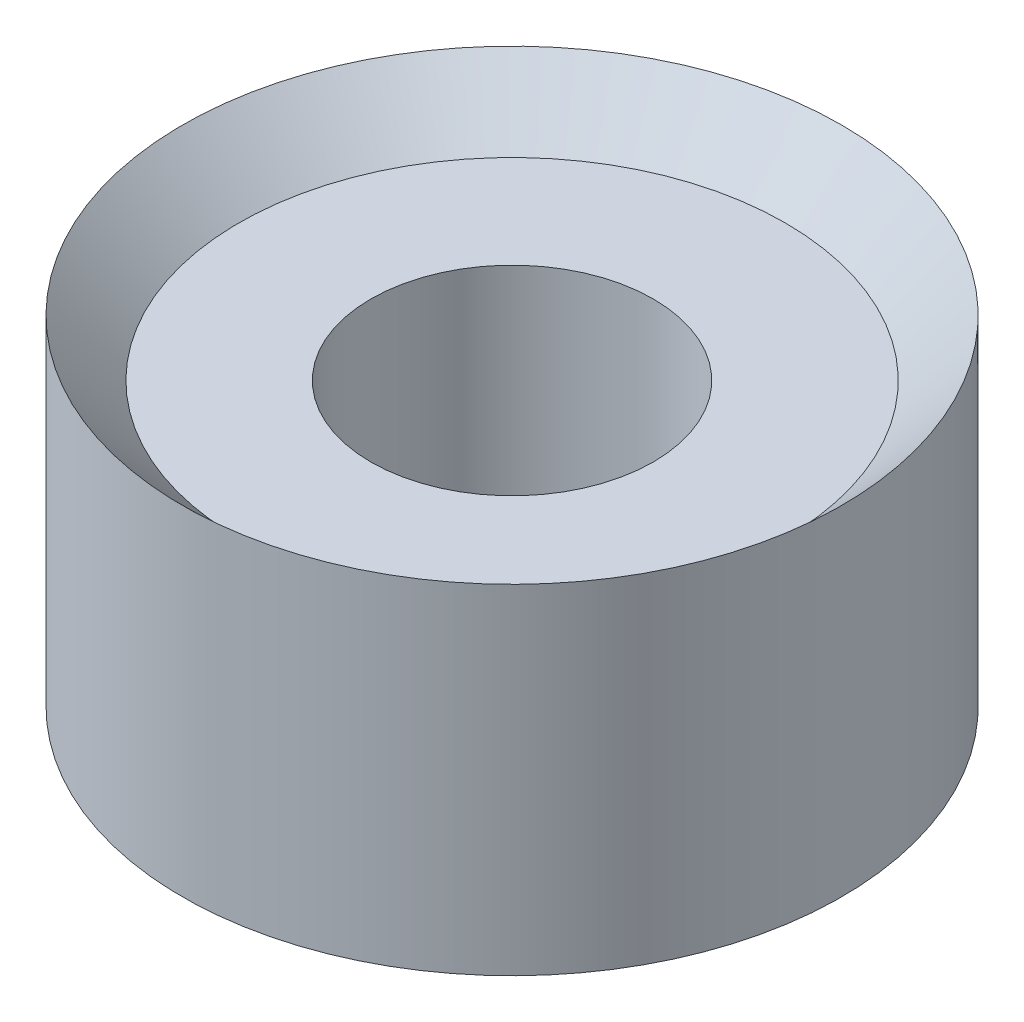
ISO-10303-21;
HEADER;
FILE_DESCRIPTION(('STEP AP214'),'2;1');
FILE_NAME('part.step','',(''),(''),'','','');
FILE_SCHEMA(('AUTOMOTIVE_DESIGN { 1 0 10303 214 1 1 1 1 }'));
ENDSEC;
DATA;
#1=APPLICATION_CONTEXT('core data for automotive mechanical design processes');
#2=APPLICATION_PROTOCOL_DEFINITION('international standard','automotive_design',2000,#1);
#3=PRODUCT_CONTEXT('',#1,'mechanical');
#4=PRODUCT('Part','Part','',(#3));
#5=PRODUCT_RELATED_PRODUCT_CATEGORY('part','',(#4));
#6=PRODUCT_DEFINITION_FORMATION('','',#4);
#7=PRODUCT_DEFINITION_CONTEXT('part definition',#1,'design');
#8=PRODUCT_DEFINITION('design','',#6,#7);
#9=PRODUCT_DEFINITION_SHAPE('','',#8);
#10=(LENGTH_UNIT() NAMED_UNIT(*) SI_UNIT(.MILLI.,.METRE.));
#11=(NAMED_UNIT(*) PLANE_ANGLE_UNIT() SI_UNIT($,.RADIAN.));
#12=(NAMED_UNIT(*) SI_UNIT($,.STERADIAN.) SOLID_ANGLE_UNIT());
#13=UNCERTAINTY_MEASURE_WITH_UNIT(LENGTH_MEASURE(1.E-05),#10,'distance_accuracy_value','');
#14=(GEOMETRIC_REPRESENTATION_CONTEXT(3) GLOBAL_UNCERTAINTY_ASSIGNED_CONTEXT((#13)) GLOBAL_UNIT_ASSIGNED_CONTEXT((#10,
#11,#12)) REPRESENTATION_CONTEXT('',''));
#15=CARTESIAN_POINT('',(0.,0.,0.));
#16=DIRECTION('',(0.,0.,1.));
#17=DIRECTION('',(1.,0.,0.));
#18=AXIS2_PLACEMENT_3D('',#15,#16,#17);
#19=CARTESIAN_POINT('',(0.,-0.9,0.));
#20=DIRECTION('',(0.,-1.,0.));
#21=DIRECTION('',(0.,0.,-1.));
#22=AXIS2_PLACEMENT_3D('',#19,#20,#21);
#23=CYLINDRICAL_SURFACE('',#22,7.5);
#24=CARTESIAN_POINT('',(0.,15.,0.));
#25=DIRECTION('',(0.,-1.,0.));
#26=DIRECTION('',(0.,0.,-1.));
#27=AXIS2_PLACEMENT_3D('',#24,#25,#26);
#28=CIRCLE('',#27,7.5);
#29=CARTESIAN_POINT('',(0.,15.,-7.5));
#30=VERTEX_POINT('',#29);
#31=EDGE_CURVE('E50',#30,#30,#28,.T.);
#32=ORIENTED_EDGE('',*,*,#31,.F.);
#33=EDGE_LOOP('',(#32));
#34=FACE_BOUND('',#33,.T.);
#35=CARTESIAN_POINT('',(0.,0.,0.));
#36=DIRECTION('',(0.,-1.,0.));
#37=DIRECTION('',(0.,0.,-1.));
#38=AXIS2_PLACEMENT_3D('',#35,#36,#37);
#39=CIRCLE('',#38,7.5);
#40=CARTESIAN_POINT('',(0.,0.,-7.5));
#41=VERTEX_POINT('',#40);
#42=EDGE_CURVE('E10',#41,#41,#39,.T.);
#43=ORIENTED_EDGE('',*,*,#42,.T.);
#44=EDGE_LOOP('',(#43));
#45=FACE_BOUND('',#44,.T.);
#46=ADVANCED_FACE('F31',(#34,#45),#23,.F.);
#47=CARTESIAN_POINT('',(-7.5,0.,0.));
#48=DIRECTION('',(0.,1.,0.));
#49=DIRECTION('',(0.,0.,1.));
#50=AXIS2_PLACEMENT_3D('',#47,#48,#49);
#51=PLANE('',#50);
#52=ORIENTED_EDGE('',*,*,#42,.F.);
#53=EDGE_LOOP('',(#52));
#54=FACE_BOUND('',#53,.T.);
#55=CARTESIAN_POINT('',(0.,0.,0.));
#56=DIRECTION('',(0.,-1.,0.));
#57=DIRECTION('',(0.,0.,-1.));
#58=AXIS2_PLACEMENT_3D('',#55,#56,#57);
#59=CIRCLE('',#58,17.5);
#60=CARTESIAN_POINT('',(0.,0.,-17.5));
#61=VERTEX_POINT('',#60);
#62=EDGE_CURVE('E37',#61,#61,#59,.T.);
#63=ORIENTED_EDGE('',*,*,#62,.T.);
#64=EDGE_LOOP('',(#63));
#65=FACE_BOUND('',#64,.T.);
#66=ADVANCED_FACE('F57',(#54,#65),#51,.F.);
#67=CARTESIAN_POINT('',(0.,-0.9,0.));
#68=DIRECTION('',(0.,-1.,0.));
#69=DIRECTION('',(0.,0.,-1.));
#70=AXIS2_PLACEMENT_3D('',#67,#68,#69);
#71=CYLINDRICAL_SURFACE('',#70,17.5);
#72=ORIENTED_EDGE('',*,*,#62,.F.);
#73=EDGE_LOOP('',(#72));
#74=FACE_BOUND('',#73,.T.);
#75=CARTESIAN_POINT('',(0.,18.,0.));
#76=DIRECTION('',(0.,-1.,0.));
#77=DIRECTION('',(0.,0.,-1.));
#78=AXIS2_PLACEMENT_3D('',#75,#76,#77);
#79=CIRCLE('',#78,17.5);
#80=CARTESIAN_POINT('',(0.,18.,-17.5));
#81=VERTEX_POINT('',#80);
#82=EDGE_CURVE('E41',#81,#81,#79,.T.);
#83=ORIENTED_EDGE('',*,*,#82,.T.);
#84=EDGE_LOOP('',(#83));
#85=FACE_BOUND('',#84,.T.);
#86=ADVANCED_FACE('F61',(#74,#85),#71,.T.);
#87=CARTESIAN_POINT('',(0.,15.,0.));
#88=DIRECTION('',(0.,1.,0.));
#89=DIRECTION('',(0.,0.,1.));
#90=AXIS2_PLACEMENT_3D('',#87,#88,#89);
#91=CONICAL_SURFACE('',#90,14.5,0.785398163397442);
#92=ORIENTED_EDGE('',*,*,#82,.F.);
#93=EDGE_LOOP('',(#92));
#94=FACE_BOUND('',#93,.T.);
#95=CARTESIAN_POINT('',(0.,15.,0.));
#96=DIRECTION('',(0.,-1.,0.));
#97=DIRECTION('',(0.,0.,-1.));
#98=AXIS2_PLACEMENT_3D('',#95,#96,#97);
#99=CIRCLE('',#98,14.5);
#100=CARTESIAN_POINT('',(0.,15.,-14.5));
#101=VERTEX_POINT('',#100);
#102=EDGE_CURVE('E45',#101,#101,#99,.T.);
#103=ORIENTED_EDGE('',*,*,#102,.T.);
#104=EDGE_LOOP('',(#103));
#105=FACE_BOUND('',#104,.T.);
#106=ADVANCED_FACE('F66',(#94,#105),#91,.F.);
#107=CARTESIAN_POINT('',(-14.5,15.,0.));
#108=DIRECTION('',(0.,-1.,0.));
#109=DIRECTION('',(0.,0.,-1.));
#110=AXIS2_PLACEMENT_3D('',#107,#108,#109);
#111=PLANE('',#110);
#112=ORIENTED_EDGE('',*,*,#102,.F.);
#113=EDGE_LOOP('',(#112));
#114=FACE_BOUND('',#113,.T.);
#115=ORIENTED_EDGE('',*,*,#31,.T.);
#116=EDGE_LOOP('',(#115));
#117=FACE_BOUND('',#116,.T.);
#118=ADVANCED_FACE('F54',(#114,#117),#111,.F.);
#119=CLOSED_SHELL('',(#46,#66,#86,#106,#118));
#120=MANIFOLD_SOLID_BREP('B2',#119);
#121=ADVANCED_BREP_SHAPE_REPRESENTATION('',(#18,#120),#14);
#122=SHAPE_DEFINITION_REPRESENTATION(#9,#121);
ENDSEC;
END-ISO-10303-21;
